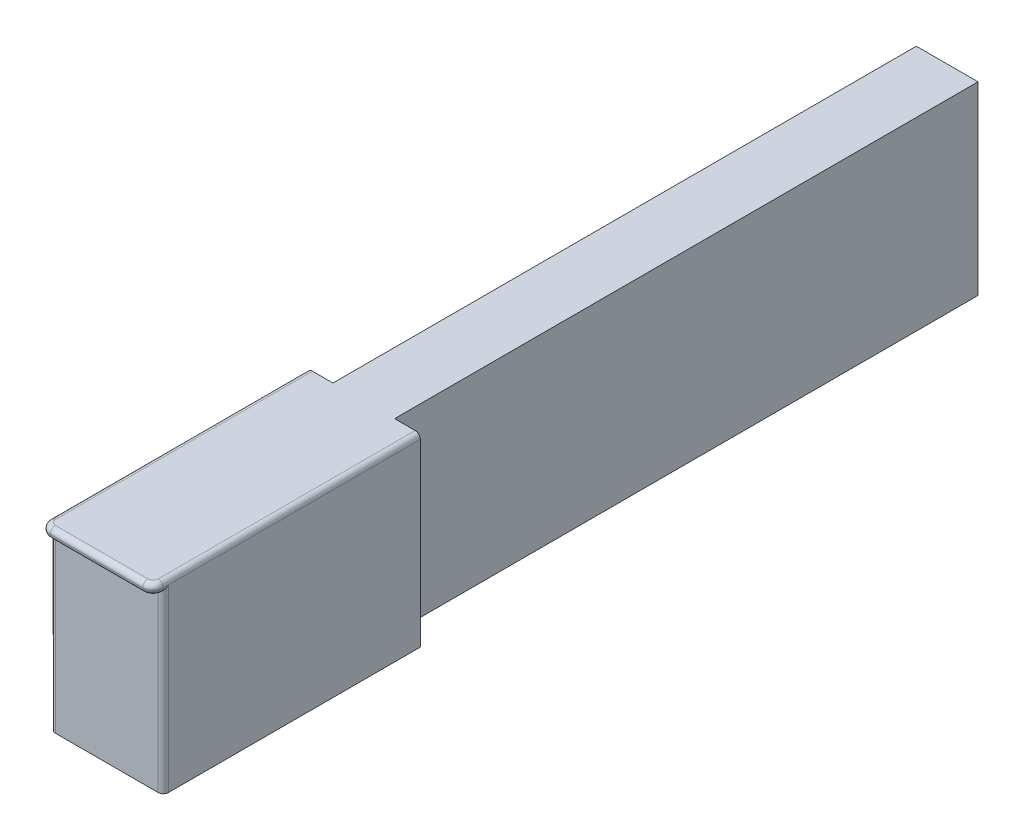
ISO-10303-21;
HEADER;
FILE_DESCRIPTION(('STEP AP214'),'2;1');
FILE_NAME('part.step','',(''),(''),'','','');
FILE_SCHEMA(('AUTOMOTIVE_DESIGN { 1 0 10303 214 1 1 1 1 }'));
ENDSEC;
DATA;
#1=APPLICATION_CONTEXT('core data for automotive mechanical design processes');
#2=APPLICATION_PROTOCOL_DEFINITION('international standard','automotive_design',2000,#1);
#3=PRODUCT_CONTEXT('',#1,'mechanical');
#4=PRODUCT('Part','Part','',(#3));
#5=PRODUCT_RELATED_PRODUCT_CATEGORY('part','',(#4));
#6=PRODUCT_DEFINITION_FORMATION('','',#4);
#7=PRODUCT_DEFINITION_CONTEXT('part definition',#1,'design');
#8=PRODUCT_DEFINITION('design','',#6,#7);
#9=PRODUCT_DEFINITION_SHAPE('','',#8);
#10=(LENGTH_UNIT() NAMED_UNIT(*) SI_UNIT(.MILLI.,.METRE.));
#11=(NAMED_UNIT(*) PLANE_ANGLE_UNIT() SI_UNIT($,.RADIAN.));
#12=(NAMED_UNIT(*) SI_UNIT($,.STERADIAN.) SOLID_ANGLE_UNIT());
#13=UNCERTAINTY_MEASURE_WITH_UNIT(LENGTH_MEASURE(1.E-05),#10,'distance_accuracy_value','');
#14=(GEOMETRIC_REPRESENTATION_CONTEXT(3) GLOBAL_UNCERTAINTY_ASSIGNED_CONTEXT((#13)) GLOBAL_UNIT_ASSIGNED_CONTEXT((#10,
#11,#12)) REPRESENTATION_CONTEXT('',''));
#15=CARTESIAN_POINT('',(0.,0.,0.));
#16=DIRECTION('',(0.,0.,1.));
#17=DIRECTION('',(1.,0.,0.));
#18=AXIS2_PLACEMENT_3D('',#15,#16,#17);
#19=CARTESIAN_POINT('',(-11.,36.,81.75));
#20=DIRECTION('',(0.,0.,-1.));
#21=DIRECTION('',(-1.,0.,0.));
#22=AXIS2_PLACEMENT_3D('',#19,#20,#21);
#23=PLANE('',#22);
#24=DIRECTION('',(1.,0.,0.));
#25=VECTOR('',#24,1.);
#26=CARTESIAN_POINT('',(-11.,34.,81.75));
#27=LINE('',#26,#25);
#28=CARTESIAN_POINT('',(-10.,34.,81.75));
#29=VERTEX_POINT('',#28);
#30=CARTESIAN_POINT('',(10.,34.,81.75));
#31=VERTEX_POINT('',#30);
#32=EDGE_CURVE('E263',#29,#31,#27,.T.);
#33=ORIENTED_EDGE('',*,*,#32,.F.);
#34=DIRECTION('',(0.,-1.,0.));
#35=VECTOR('',#34,1.);
#36=CARTESIAN_POINT('',(-10.,0.,81.75));
#37=LINE('',#36,#35);
#38=CARTESIAN_POINT('',(-10.,0.,81.75));
#39=VERTEX_POINT('',#38);
#40=EDGE_CURVE('E190',#29,#39,#37,.T.);
#41=ORIENTED_EDGE('',*,*,#40,.T.);
#42=DIRECTION('',(1.,0.,0.));
#43=VECTOR('',#42,1.);
#44=CARTESIAN_POINT('',(-11.,0.,81.75));
#45=LINE('',#44,#43);
#46=CARTESIAN_POINT('',(10.,0.,81.75));
#47=VERTEX_POINT('',#46);
#48=EDGE_CURVE('E299',#39,#47,#45,.T.);
#49=ORIENTED_EDGE('',*,*,#48,.T.);
#50=DIRECTION('',(0.,-1.,0.));
#51=VECTOR('',#50,1.);
#52=CARTESIAN_POINT('',(10.,36.,81.75));
#53=LINE('',#52,#51);
#54=EDGE_CURVE('E181',#47,#31,#53,.F.);
#55=ORIENTED_EDGE('',*,*,#54,.T.);
#56=EDGE_LOOP('',(#33,#41,#49,#55));
#57=FACE_BOUND('',#56,.T.);
#58=ADVANCED_FACE('F43',(#57),#23,.F.);
#59=CARTESIAN_POINT('',(-10.,36.,80.75));
#60=DIRECTION('',(0.,1.,0.));
#61=DIRECTION('',(0.,0.,1.));
#62=AXIS2_PLACEMENT_3D('',#59,#60,#61);
#63=CYLINDRICAL_SURFACE('',#62,1.);
#64=ORIENTED_EDGE('',*,*,#40,.F.);
#65=CARTESIAN_POINT('',(-10.,35.,80.75));
#66=DIRECTION('',(0.,-0.707106781186547,-0.707106781186547));
#67=DIRECTION('',(0.,0.707106781186547,-0.707106781186547));
#68=AXIS2_PLACEMENT_3D('',#65,#66,#67);
#69=ELLIPSE('',#68,1.41421356237309,1.);
#70=CARTESIAN_POINT('',(-11.,35.,80.75));
#71=VERTEX_POINT('',#70);
#72=EDGE_CURVE('E219',#29,#71,#69,.T.);
#73=ORIENTED_EDGE('',*,*,#72,.T.);
#74=DIRECTION('',(0.,-1.,0.));
#75=VECTOR('',#74,1.);
#76=CARTESIAN_POINT('',(-11.,36.,80.75));
#77=LINE('',#76,#75);
#78=CARTESIAN_POINT('',(-11.,0.,80.75));
#79=VERTEX_POINT('',#78);
#80=EDGE_CURVE('E195',#79,#71,#77,.F.);
#81=ORIENTED_EDGE('',*,*,#80,.F.);
#82=CARTESIAN_POINT('',(-10.,0.,80.75));
#83=DIRECTION('',(0.,1.,0.));
#84=DIRECTION('',(0.,0.,1.));
#85=AXIS2_PLACEMENT_3D('',#82,#83,#84);
#86=CIRCLE('',#85,1.);
#87=EDGE_CURVE('E176',#39,#79,#86,.F.);
#88=ORIENTED_EDGE('',*,*,#87,.F.);
#89=EDGE_LOOP('',(#64,#73,#81,#88));
#90=FACE_BOUND('',#89,.T.);
#91=ADVANCED_FACE('F369',(#90),#63,.T.);
#92=CARTESIAN_POINT('',(10.,36.,80.75));
#93=DIRECTION('',(0.,-1.,0.));
#94=DIRECTION('',(0.,0.,-1.));
#95=AXIS2_PLACEMENT_3D('',#92,#93,#94);
#96=CYLINDRICAL_SURFACE('',#95,1.);
#97=DIRECTION('',(0.,-1.,0.));
#98=VECTOR('',#97,1.);
#99=CARTESIAN_POINT('',(11.,36.,80.75));
#100=LINE('',#99,#98);
#101=CARTESIAN_POINT('',(11.,35.,80.75));
#102=VERTEX_POINT('',#101);
#103=CARTESIAN_POINT('',(11.,0.,80.75));
#104=VERTEX_POINT('',#103);
#105=EDGE_CURVE('E197',#102,#104,#100,.T.);
#106=ORIENTED_EDGE('',*,*,#105,.F.);
#107=CARTESIAN_POINT('',(10.,35.,80.75));
#108=DIRECTION('',(0.,-0.707106781186547,-0.707106781186547));
#109=DIRECTION('',(0.,0.707106781186547,-0.707106781186547));
#110=AXIS2_PLACEMENT_3D('',#107,#108,#109);
#111=ELLIPSE('',#110,1.41421356237309,1.);
#112=EDGE_CURVE('E222',#102,#31,#111,.T.);
#113=ORIENTED_EDGE('',*,*,#112,.T.);
#114=ORIENTED_EDGE('',*,*,#54,.F.);
#115=CARTESIAN_POINT('',(10.,0.,80.75));
#116=DIRECTION('',(0.,1.,0.));
#117=DIRECTION('',(0.,0.,1.));
#118=AXIS2_PLACEMENT_3D('',#115,#116,#117);
#119=CIRCLE('',#118,1.);
#120=EDGE_CURVE('E192',#104,#47,#119,.F.);
#121=ORIENTED_EDGE('',*,*,#120,.F.);
#122=EDGE_LOOP('',(#106,#113,#114,#121));
#123=FACE_BOUND('',#122,.T.);
#124=ADVANCED_FACE('F289',(#123),#96,.T.);
#125=CARTESIAN_POINT('',(11.,36.,81.75));
#126=DIRECTION('',(-1.,0.,0.));
#127=DIRECTION('',(0.,0.,1.));
#128=AXIS2_PLACEMENT_3D('',#125,#126,#127);
#129=PLANE('',#128);
#130=DIRECTION('',(0.,0.,-1.));
#131=VECTOR('',#130,1.);
#132=CARTESIAN_POINT('',(11.,0.,81.75));
#133=LINE('',#132,#131);
#134=CARTESIAN_POINT('',(11.,0.,31.75));
#135=VERTEX_POINT('',#134);
#136=EDGE_CURVE('E184',#104,#135,#133,.T.);
#137=ORIENTED_EDGE('',*,*,#136,.T.);
#138=DIRECTION('',(0.,1.,0.));
#139=VECTOR('',#138,1.);
#140=CARTESIAN_POINT('',(11.,0.,31.75));
#141=LINE('',#140,#139);
#142=CARTESIAN_POINT('',(11.,35.,31.75));
#143=VERTEX_POINT('',#142);
#144=EDGE_CURVE('E267',#135,#143,#141,.T.);
#145=ORIENTED_EDGE('',*,*,#144,.T.);
#146=DIRECTION('',(0.,0.,-1.));
#147=VECTOR('',#146,1.);
#148=CARTESIAN_POINT('',(11.,35.,81.75));
#149=LINE('',#148,#147);
#150=EDGE_CURVE('E210',#143,#102,#149,.F.);
#151=ORIENTED_EDGE('',*,*,#150,.T.);
#152=ORIENTED_EDGE('',*,*,#105,.T.);
#153=EDGE_LOOP('',(#137,#145,#151,#152));
#154=FACE_BOUND('',#153,.T.);
#155=ADVANCED_FACE('F274',(#154),#129,.F.);
#156=CARTESIAN_POINT('',(-11.,36.,-81.75));
#157=DIRECTION('',(0.,0.,-1.));
#158=DIRECTION('',(-1.,0.,0.));
#159=AXIS2_PLACEMENT_3D('',#156,#157,#158);
#160=PLANE('',#159);
#161=DIRECTION('',(0.,1.,0.));
#162=VECTOR('',#161,1.);
#163=CARTESIAN_POINT('',(-6.,0.,-81.75));
#164=LINE('',#163,#162);
#165=CARTESIAN_POINT('',(-6.,0.,-81.75));
#166=VERTEX_POINT('',#165);
#167=CARTESIAN_POINT('',(-6.,36.,-81.75));
#168=VERTEX_POINT('',#167);
#169=EDGE_CURVE('E228',#166,#168,#164,.T.);
#170=ORIENTED_EDGE('',*,*,#169,.T.);
#171=DIRECTION('',(1.,0.,0.));
#172=VECTOR('',#171,1.);
#173=CARTESIAN_POINT('',(-11.,36.,-81.75));
#174=LINE('',#173,#172);
#175=CARTESIAN_POINT('',(6.,36.,-81.75));
#176=VERTEX_POINT('',#175);
#177=EDGE_CURVE('E177',#168,#176,#174,.T.);
#178=ORIENTED_EDGE('',*,*,#177,.T.);
#179=DIRECTION('',(0.,1.,0.));
#180=VECTOR('',#179,1.);
#181=CARTESIAN_POINT('',(6.,0.,-81.75));
#182=LINE('',#181,#180);
#183=CARTESIAN_POINT('',(6.,0.,-81.75));
#184=VERTEX_POINT('',#183);
#185=EDGE_CURVE('E344',#184,#176,#182,.T.);
#186=ORIENTED_EDGE('',*,*,#185,.F.);
#187=DIRECTION('',(1.,0.,0.));
#188=VECTOR('',#187,1.);
#189=CARTESIAN_POINT('',(-11.,0.,-81.75));
#190=LINE('',#189,#188);
#191=EDGE_CURVE('E178',#166,#184,#190,.T.);
#192=ORIENTED_EDGE('',*,*,#191,.F.);
#193=EDGE_LOOP('',(#170,#178,#186,#192));
#194=FACE_BOUND('',#193,.T.);
#195=ADVANCED_FACE('F357',(#194),#160,.T.);
#196=CARTESIAN_POINT('',(-11.,36.,81.75));
#197=DIRECTION('',(-1.,0.,0.));
#198=DIRECTION('',(0.,0.,1.));
#199=AXIS2_PLACEMENT_3D('',#196,#197,#198);
#200=PLANE('',#199);
#201=DIRECTION('',(0.,1.,0.));
#202=VECTOR('',#201,1.);
#203=CARTESIAN_POINT('',(-11.,0.,31.75));
#204=LINE('',#203,#202);
#205=CARTESIAN_POINT('',(-11.,0.,31.75));
#206=VERTEX_POINT('',#205);
#207=CARTESIAN_POINT('',(-11.,35.,31.75));
#208=VERTEX_POINT('',#207);
#209=EDGE_CURVE('E57',#206,#208,#204,.T.);
#210=ORIENTED_EDGE('',*,*,#209,.F.);
#211=DIRECTION('',(0.,0.,-1.));
#212=VECTOR('',#211,1.);
#213=CARTESIAN_POINT('',(-11.,0.,81.75));
#214=LINE('',#213,#212);
#215=EDGE_CURVE('E168',#79,#206,#214,.T.);
#216=ORIENTED_EDGE('',*,*,#215,.F.);
#217=ORIENTED_EDGE('',*,*,#80,.T.);
#218=DIRECTION('',(0.,0.,-1.));
#219=VECTOR('',#218,1.);
#220=CARTESIAN_POINT('',(-11.,35.,81.75));
#221=LINE('',#220,#219);
#222=EDGE_CURVE('E171',#71,#208,#221,.T.);
#223=ORIENTED_EDGE('',*,*,#222,.T.);
#224=EDGE_LOOP('',(#210,#216,#217,#223));
#225=FACE_BOUND('',#224,.T.);
#226=ADVANCED_FACE('F167',(#225),#200,.T.);
#227=CARTESIAN_POINT('',(0.,36.,0.));
#228=DIRECTION('',(0.,1.,0.));
#229=DIRECTION('',(0.,0.,1.));
#230=AXIS2_PLACEMENT_3D('',#227,#228,#229);
#231=PLANE('',#230);
#232=DIRECTION('',(0.,0.,-1.));
#233=VECTOR('',#232,1.);
#234=CARTESIAN_POINT('',(-6.,36.,-81.75));
#235=LINE('',#234,#233);
#236=CARTESIAN_POINT('',(-5.99999999999999,36.,31.75));
#237=VERTEX_POINT('',#236);
#238=EDGE_CURVE('E162',#237,#168,#235,.T.);
#239=ORIENTED_EDGE('',*,*,#238,.F.);
#240=DIRECTION('',(1.,0.,0.));
#241=VECTOR('',#240,1.);
#242=CARTESIAN_POINT('',(-11.,36.,31.75));
#243=LINE('',#242,#241);
#244=CARTESIAN_POINT('',(-10.,36.,31.75));
#245=VERTEX_POINT('',#244);
#246=EDGE_CURVE('E277',#245,#237,#243,.T.);
#247=ORIENTED_EDGE('',*,*,#246,.F.);
#248=DIRECTION('',(0.,0.,-1.));
#249=VECTOR('',#248,1.);
#250=CARTESIAN_POINT('',(-10.,36.,0.));
#251=LINE('',#250,#249);
#252=CARTESIAN_POINT('',(-10.,36.,81.75));
#253=VERTEX_POINT('',#252);
#254=EDGE_CURVE('E199',#245,#253,#251,.F.);
#255=ORIENTED_EDGE('',*,*,#254,.T.);
#256=CARTESIAN_POINT('',(-9.,36.,81.75));
#257=DIRECTION('',(0.,1.,0.));
#258=DIRECTION('',(0.,0.,1.));
#259=AXIS2_PLACEMENT_3D('',#256,#257,#258);
#260=CIRCLE('',#259,1.);
#261=CARTESIAN_POINT('',(-9.,36.,82.75));
#262=VERTEX_POINT('',#261);
#263=EDGE_CURVE('E201',#253,#262,#260,.T.);
#264=ORIENTED_EDGE('',*,*,#263,.T.);
#265=DIRECTION('',(1.,0.,0.));
#266=VECTOR('',#265,1.);
#267=CARTESIAN_POINT('',(0.,36.,82.75));
#268=LINE('',#267,#266);
#269=CARTESIAN_POINT('',(9.,36.,82.75));
#270=VERTEX_POINT('',#269);
#271=EDGE_CURVE('E203',#262,#270,#268,.T.);
#272=ORIENTED_EDGE('',*,*,#271,.T.);
#273=CARTESIAN_POINT('',(9.,36.,81.75));
#274=DIRECTION('',(0.,1.,0.));
#275=DIRECTION('',(0.,0.,1.));
#276=AXIS2_PLACEMENT_3D('',#273,#274,#275);
#277=CIRCLE('',#276,1.);
#278=CARTESIAN_POINT('',(10.,36.,81.75));
#279=VERTEX_POINT('',#278);
#280=EDGE_CURVE('E205',#270,#279,#277,.T.);
#281=ORIENTED_EDGE('',*,*,#280,.T.);
#282=DIRECTION('',(0.,0.,-1.));
#283=VECTOR('',#282,1.);
#284=CARTESIAN_POINT('',(10.,36.,-81.75));
#285=LINE('',#284,#283);
#286=CARTESIAN_POINT('',(10.,36.,31.75));
#287=VERTEX_POINT('',#286);
#288=EDGE_CURVE('E207',#279,#287,#285,.T.);
#289=ORIENTED_EDGE('',*,*,#288,.T.);
#290=DIRECTION('',(1.,0.,0.));
#291=VECTOR('',#290,1.);
#292=CARTESIAN_POINT('',(11.,36.,31.75));
#293=LINE('',#292,#291);
#294=CARTESIAN_POINT('',(6.00000000000002,36.,31.75));
#295=VERTEX_POINT('',#294);
#296=EDGE_CURVE('E65',#295,#287,#293,.T.);
#297=ORIENTED_EDGE('',*,*,#296,.F.);
#298=DIRECTION('',(0.,0.,1.));
#299=VECTOR('',#298,1.);
#300=CARTESIAN_POINT('',(6.,36.,-81.75));
#301=LINE('',#300,#299);
#302=EDGE_CURVE('E345',#176,#295,#301,.T.);
#303=ORIENTED_EDGE('',*,*,#302,.F.);
#304=ORIENTED_EDGE('',*,*,#177,.F.);
#305=EDGE_LOOP('',(#239,#247,#255,#264,#272,#281,#289,#297,#303,#304));
#306=FACE_BOUND('',#305,.T.);
#307=ADVANCED_FACE('F330',(#306),#231,.T.);
#308=CARTESIAN_POINT('',(0.,0.,0.));
#309=DIRECTION('',(0.,1.,0.));
#310=DIRECTION('',(0.,0.,1.));
#311=AXIS2_PLACEMENT_3D('',#308,#309,#310);
#312=PLANE('',#311);
#313=DIRECTION('',(1.,0.,0.));
#314=VECTOR('',#313,1.);
#315=CARTESIAN_POINT('',(-11.,0.,31.75));
#316=LINE('',#315,#314);
#317=CARTESIAN_POINT('',(-5.99999999999999,0.,31.75));
#318=VERTEX_POINT('',#317);
#319=EDGE_CURVE('E153',#206,#318,#316,.T.);
#320=ORIENTED_EDGE('',*,*,#319,.T.);
#321=DIRECTION('',(0.,0.,-1.));
#322=VECTOR('',#321,1.);
#323=CARTESIAN_POINT('',(-6.,0.,-81.75));
#324=LINE('',#323,#322);
#325=EDGE_CURVE('E161',#318,#166,#324,.T.);
#326=ORIENTED_EDGE('',*,*,#325,.T.);
#327=ORIENTED_EDGE('',*,*,#191,.T.);
#328=DIRECTION('',(0.,0.,1.));
#329=VECTOR('',#328,1.);
#330=CARTESIAN_POINT('',(6.,0.,-81.75));
#331=LINE('',#330,#329);
#332=CARTESIAN_POINT('',(6.00000000000002,0.,31.75));
#333=VERTEX_POINT('',#332);
#334=EDGE_CURVE('E339',#184,#333,#331,.T.);
#335=ORIENTED_EDGE('',*,*,#334,.T.);
#336=DIRECTION('',(1.,0.,0.));
#337=VECTOR('',#336,1.);
#338=CARTESIAN_POINT('',(11.,0.,31.75));
#339=LINE('',#338,#337);
#340=EDGE_CURVE('E342',#333,#135,#339,.T.);
#341=ORIENTED_EDGE('',*,*,#340,.T.);
#342=ORIENTED_EDGE('',*,*,#136,.F.);
#343=ORIENTED_EDGE('',*,*,#120,.T.);
#344=ORIENTED_EDGE('',*,*,#48,.F.);
#345=ORIENTED_EDGE('',*,*,#87,.T.);
#346=ORIENTED_EDGE('',*,*,#215,.T.);
#347=EDGE_LOOP('',(#320,#326,#327,#335,#341,#342,#343,#344,#345,#346));
#348=FACE_BOUND('',#347,.T.);
#349=ADVANCED_FACE('F173',(#348),#312,.F.);
#350=CARTESIAN_POINT('',(0.,34.,0.));
#351=DIRECTION('',(0.,1.,0.));
#352=DIRECTION('',(0.,0.,1.));
#353=AXIS2_PLACEMENT_3D('',#350,#351,#352);
#354=PLANE('',#353);
#355=DIRECTION('',(1.,0.,0.));
#356=VECTOR('',#355,1.);
#357=CARTESIAN_POINT('',(-9.,34.,82.75));
#358=LINE('',#357,#356);
#359=CARTESIAN_POINT('',(9.,34.,82.75));
#360=VERTEX_POINT('',#359);
#361=CARTESIAN_POINT('',(-9.,34.,82.75));
#362=VERTEX_POINT('',#361);
#363=EDGE_CURVE('E213',#360,#362,#358,.F.);
#364=ORIENTED_EDGE('',*,*,#363,.T.);
#365=CARTESIAN_POINT('',(-9.,34.,81.75));
#366=DIRECTION('',(0.,1.,0.));
#367=DIRECTION('',(0.,0.,1.));
#368=AXIS2_PLACEMENT_3D('',#365,#366,#367);
#369=CIRCLE('',#368,1.);
#370=EDGE_CURVE('E217',#362,#29,#369,.F.);
#371=ORIENTED_EDGE('',*,*,#370,.T.);
#372=ORIENTED_EDGE('',*,*,#32,.T.);
#373=CARTESIAN_POINT('',(9.,34.,81.75));
#374=DIRECTION('',(0.,1.,0.));
#375=DIRECTION('',(0.,0.,1.));
#376=AXIS2_PLACEMENT_3D('',#373,#374,#375);
#377=CIRCLE('',#376,1.);
#378=EDGE_CURVE('E215',#31,#360,#377,.F.);
#379=ORIENTED_EDGE('',*,*,#378,.T.);
#380=EDGE_LOOP('',(#364,#371,#372,#379));
#381=FACE_BOUND('',#380,.T.);
#382=ADVANCED_FACE('F293',(#381),#354,.F.);
#383=CARTESIAN_POINT('',(-10.,35.,81.75));
#384=DIRECTION('',(0.,0.,-1.));
#385=DIRECTION('',(-1.,0.,0.));
#386=AXIS2_PLACEMENT_3D('',#383,#384,#385);
#387=CYLINDRICAL_SURFACE('',#386,1.);
#388=DIRECTION('',(0.,0.,1.));
#389=VECTOR('',#388,1.);
#390=CARTESIAN_POINT('',(-11.,35.,81.75));
#391=LINE('',#390,#389);
#392=CARTESIAN_POINT('',(-11.,35.,81.75));
#393=VERTEX_POINT('',#392);
#394=EDGE_CURVE('E258',#71,#393,#391,.T.);
#395=ORIENTED_EDGE('',*,*,#394,.F.);
#396=ORIENTED_EDGE('',*,*,#72,.F.);
#397=CARTESIAN_POINT('',(-10.,35.,81.75));
#398=DIRECTION('',(0.,0.,1.));
#399=DIRECTION('',(1.,0.,0.));
#400=AXIS2_PLACEMENT_3D('',#397,#398,#399);
#401=CIRCLE('',#400,1.);
#402=EDGE_CURVE('E261',#393,#29,#401,.T.);
#403=ORIENTED_EDGE('',*,*,#402,.F.);
#404=EDGE_LOOP('',(#395,#396,#403));
#405=FACE_BOUND('',#404,.T.);
#406=ADVANCED_FACE('F45',(#405),#387,.T.);
#407=CARTESIAN_POINT('',(-9.,35.,81.75));
#408=DIRECTION('',(0.,1.,0.));
#409=DIRECTION('',(0.,0.,1.));
#410=AXIS2_PLACEMENT_3D('',#407,#408,#409);
#411=DEGENERATE_TOROIDAL_SURFACE('',#410,1.,1.,.T.);
#412=ORIENTED_EDGE('',*,*,#402,.T.);
#413=ORIENTED_EDGE('',*,*,#370,.F.);
#414=CARTESIAN_POINT('',(-9.,35.,82.75));
#415=DIRECTION('',(1.,0.,0.));
#416=DIRECTION('',(0.,0.,-1.));
#417=AXIS2_PLACEMENT_3D('',#414,#415,#416);
#418=CIRCLE('',#417,1.);
#419=CARTESIAN_POINT('',(-9.,35.,83.75));
#420=VERTEX_POINT('',#419);
#421=EDGE_CURVE('E255',#420,#362,#418,.T.);
#422=ORIENTED_EDGE('',*,*,#421,.F.);
#423=CARTESIAN_POINT('',(-9.,35.,81.75));
#424=DIRECTION('',(0.,1.,0.));
#425=DIRECTION('',(0.,0.,1.));
#426=AXIS2_PLACEMENT_3D('',#423,#424,#425);
#427=CIRCLE('',#426,2.);
#428=EDGE_CURVE('E252',#393,#420,#427,.T.);
#429=ORIENTED_EDGE('',*,*,#428,.F.);
#430=EDGE_LOOP('',(#412,#413,#422,#429));
#431=FACE_BOUND('',#430,.T.);
#432=ADVANCED_FACE('F320',(#431),#411,.T.);
#433=CARTESIAN_POINT('',(-10.,35.,81.75));
#434=DIRECTION('',(0.,0.,-1.));
#435=DIRECTION('',(-1.,0.,0.));
#436=AXIS2_PLACEMENT_3D('',#433,#434,#435);
#437=CYLINDRICAL_SURFACE('',#436,1.);
#438=CARTESIAN_POINT('',(-10.,35.,31.75));
#439=DIRECTION('',(0.,0.,1.));
#440=DIRECTION('',(1.,0.,0.));
#441=AXIS2_PLACEMENT_3D('',#438,#439,#440);
#442=CIRCLE('',#441,1.);
#443=EDGE_CURVE('E11',#208,#245,#442,.F.);
#444=ORIENTED_EDGE('',*,*,#443,.F.);
#445=ORIENTED_EDGE('',*,*,#222,.F.);
#446=ORIENTED_EDGE('',*,*,#394,.T.);
#447=CARTESIAN_POINT('',(-10.,35.,81.75));
#448=DIRECTION('',(0.,0.,1.));
#449=DIRECTION('',(1.,0.,0.));
#450=AXIS2_PLACEMENT_3D('',#447,#448,#449);
#451=CIRCLE('',#450,1.);
#452=EDGE_CURVE('E249',#253,#393,#451,.T.);
#453=ORIENTED_EDGE('',*,*,#452,.F.);
#454=ORIENTED_EDGE('',*,*,#254,.F.);
#455=EDGE_LOOP('',(#444,#445,#446,#453,#454));
#456=FACE_BOUND('',#455,.T.);
#457=ADVANCED_FACE('F325',(#456),#437,.T.);
#458=CARTESIAN_POINT('',(-11.,35.,82.75));
#459=DIRECTION('',(-1.,0.,0.));
#460=DIRECTION('',(0.,0.,1.));
#461=AXIS2_PLACEMENT_3D('',#458,#459,#460);
#462=CYLINDRICAL_SURFACE('',#461,1.);
#463=ORIENTED_EDGE('',*,*,#421,.T.);
#464=ORIENTED_EDGE('',*,*,#363,.F.);
#465=CARTESIAN_POINT('',(9.,35.,82.75));
#466=DIRECTION('',(1.,0.,0.));
#467=DIRECTION('',(0.,0.,-1.));
#468=AXIS2_PLACEMENT_3D('',#465,#466,#467);
#469=CIRCLE('',#468,1.);
#470=CARTESIAN_POINT('',(9.,35.,83.75));
#471=VERTEX_POINT('',#470);
#472=EDGE_CURVE('E246',#471,#360,#469,.T.);
#473=ORIENTED_EDGE('',*,*,#472,.F.);
#474=DIRECTION('',(1.,0.,0.));
#475=VECTOR('',#474,1.);
#476=CARTESIAN_POINT('',(9.,35.,83.75));
#477=LINE('',#476,#475);
#478=EDGE_CURVE('E243',#420,#471,#477,.T.);
#479=ORIENTED_EDGE('',*,*,#478,.F.);
#480=EDGE_LOOP('',(#463,#464,#473,#479));
#481=FACE_BOUND('',#480,.T.);
#482=ADVANCED_FACE('F307',(#481),#462,.T.);
#483=CARTESIAN_POINT('',(-9.,35.,81.75));
#484=DIRECTION('',(0.,1.,0.));
#485=DIRECTION('',(0.,0.,1.));
#486=AXIS2_PLACEMENT_3D('',#483,#484,#485);
#487=DEGENERATE_TOROIDAL_SURFACE('',#486,1.,1.,.T.);
#488=ORIENTED_EDGE('',*,*,#452,.T.);
#489=ORIENTED_EDGE('',*,*,#428,.T.);
#490=CARTESIAN_POINT('',(-9.,35.,82.75));
#491=DIRECTION('',(1.,0.,0.));
#492=DIRECTION('',(0.,0.,-1.));
#493=AXIS2_PLACEMENT_3D('',#490,#491,#492);
#494=CIRCLE('',#493,1.);
#495=EDGE_CURVE('E240',#262,#420,#494,.T.);
#496=ORIENTED_EDGE('',*,*,#495,.F.);
#497=ORIENTED_EDGE('',*,*,#263,.F.);
#498=EDGE_LOOP('',(#488,#489,#496,#497));
#499=FACE_BOUND('',#498,.T.);
#500=ADVANCED_FACE('F316',(#499),#487,.T.);
#501=CARTESIAN_POINT('',(9.,35.,81.75));
#502=DIRECTION('',(0.,1.,0.));
#503=DIRECTION('',(0.,0.,1.));
#504=AXIS2_PLACEMENT_3D('',#501,#502,#503);
#505=DEGENERATE_TOROIDAL_SURFACE('',#504,1.,1.,.T.);
#506=ORIENTED_EDGE('',*,*,#472,.T.);
#507=ORIENTED_EDGE('',*,*,#378,.F.);
#508=CARTESIAN_POINT('',(10.,35.,81.75));
#509=DIRECTION('',(0.,0.,-1.));
#510=DIRECTION('',(-1.,0.,0.));
#511=AXIS2_PLACEMENT_3D('',#508,#509,#510);
#512=CIRCLE('',#511,1.);
#513=CARTESIAN_POINT('',(11.,35.,81.75));
#514=VERTEX_POINT('',#513);
#515=EDGE_CURVE('E237',#514,#31,#512,.T.);
#516=ORIENTED_EDGE('',*,*,#515,.F.);
#517=CARTESIAN_POINT('',(9.,35.,81.75));
#518=DIRECTION('',(0.,1.,0.));
#519=DIRECTION('',(0.,0.,1.));
#520=AXIS2_PLACEMENT_3D('',#517,#518,#519);
#521=CIRCLE('',#520,2.);
#522=EDGE_CURVE('E234',#471,#514,#521,.T.);
#523=ORIENTED_EDGE('',*,*,#522,.F.);
#524=EDGE_LOOP('',(#506,#507,#516,#523));
#525=FACE_BOUND('',#524,.T.);
#526=ADVANCED_FACE('F303',(#525),#505,.T.);
#527=CARTESIAN_POINT('',(0.,35.,82.75));
#528=DIRECTION('',(1.,0.,0.));
#529=DIRECTION('',(0.,0.,-1.));
#530=AXIS2_PLACEMENT_3D('',#527,#528,#529);
#531=CYLINDRICAL_SURFACE('',#530,1.);
#532=ORIENTED_EDGE('',*,*,#495,.T.);
#533=ORIENTED_EDGE('',*,*,#478,.T.);
#534=CARTESIAN_POINT('',(9.,35.,82.75));
#535=DIRECTION('',(1.,0.,0.));
#536=DIRECTION('',(0.,0.,-1.));
#537=AXIS2_PLACEMENT_3D('',#534,#535,#536);
#538=CIRCLE('',#537,1.);
#539=EDGE_CURVE('E231',#270,#471,#538,.T.);
#540=ORIENTED_EDGE('',*,*,#539,.F.);
#541=ORIENTED_EDGE('',*,*,#271,.F.);
#542=EDGE_LOOP('',(#532,#533,#540,#541));
#543=FACE_BOUND('',#542,.T.);
#544=ADVANCED_FACE('F310',(#543),#531,.T.);
#545=CARTESIAN_POINT('',(10.,35.,81.75));
#546=DIRECTION('',(0.,0.,-1.));
#547=DIRECTION('',(-1.,0.,0.));
#548=AXIS2_PLACEMENT_3D('',#545,#546,#547);
#549=CYLINDRICAL_SURFACE('',#548,1.);
#550=ORIENTED_EDGE('',*,*,#515,.T.);
#551=ORIENTED_EDGE('',*,*,#112,.F.);
#552=DIRECTION('',(0.,0.,-1.));
#553=VECTOR('',#552,1.);
#554=CARTESIAN_POINT('',(11.,35.,81.75));
#555=LINE('',#554,#553);
#556=EDGE_CURVE('E227',#514,#102,#555,.T.);
#557=ORIENTED_EDGE('',*,*,#556,.F.);
#558=EDGE_LOOP('',(#550,#551,#557));
#559=FACE_BOUND('',#558,.T.);
#560=ADVANCED_FACE('F285',(#559),#549,.T.);
#561=CARTESIAN_POINT('',(9.,35.,81.75));
#562=DIRECTION('',(0.,1.,0.));
#563=DIRECTION('',(0.,0.,1.));
#564=AXIS2_PLACEMENT_3D('',#561,#562,#563);
#565=DEGENERATE_TOROIDAL_SURFACE('',#564,1.,1.,.T.);
#566=ORIENTED_EDGE('',*,*,#539,.T.);
#567=ORIENTED_EDGE('',*,*,#522,.T.);
#568=CARTESIAN_POINT('',(10.,35.,81.75));
#569=DIRECTION('',(0.,0.,-1.));
#570=DIRECTION('',(-1.,0.,0.));
#571=AXIS2_PLACEMENT_3D('',#568,#569,#570);
#572=CIRCLE('',#571,1.);
#573=EDGE_CURVE('E224',#279,#514,#572,.T.);
#574=ORIENTED_EDGE('',*,*,#573,.F.);
#575=ORIENTED_EDGE('',*,*,#280,.F.);
#576=EDGE_LOOP('',(#566,#567,#574,#575));
#577=FACE_BOUND('',#576,.T.);
#578=ADVANCED_FACE('F383',(#577),#565,.T.);
#579=CARTESIAN_POINT('',(10.,35.,0.));
#580=DIRECTION('',(0.,0.,1.));
#581=DIRECTION('',(1.,0.,0.));
#582=AXIS2_PLACEMENT_3D('',#579,#580,#581);
#583=CYLINDRICAL_SURFACE('',#582,1.);
#584=CARTESIAN_POINT('',(10.,35.,31.75));
#585=DIRECTION('',(0.,0.,1.));
#586=DIRECTION('',(1.,0.,0.));
#587=AXIS2_PLACEMENT_3D('',#584,#585,#586);
#588=CIRCLE('',#587,1.);
#589=EDGE_CURVE('E51',#287,#143,#588,.F.);
#590=ORIENTED_EDGE('',*,*,#589,.F.);
#591=ORIENTED_EDGE('',*,*,#288,.F.);
#592=ORIENTED_EDGE('',*,*,#573,.T.);
#593=ORIENTED_EDGE('',*,*,#556,.T.);
#594=ORIENTED_EDGE('',*,*,#150,.F.);
#595=EDGE_LOOP('',(#590,#591,#592,#593,#594));
#596=FACE_BOUND('',#595,.T.);
#597=ADVANCED_FACE('F280',(#596),#583,.T.);
#598=CARTESIAN_POINT('',(11.,0.,31.75));
#599=DIRECTION('',(0.,0.,1.));
#600=DIRECTION('',(1.,0.,0.));
#601=AXIS2_PLACEMENT_3D('',#598,#599,#600);
#602=PLANE('',#601);
#603=ORIENTED_EDGE('',*,*,#589,.T.);
#604=ORIENTED_EDGE('',*,*,#144,.F.);
#605=ORIENTED_EDGE('',*,*,#340,.F.);
#606=DIRECTION('',(0.,1.,0.));
#607=VECTOR('',#606,1.);
#608=CARTESIAN_POINT('',(6.00000000000002,0.,31.75));
#609=LINE('',#608,#607);
#610=EDGE_CURVE('E278',#333,#295,#609,.T.);
#611=ORIENTED_EDGE('',*,*,#610,.T.);
#612=ORIENTED_EDGE('',*,*,#296,.T.);
#613=EDGE_LOOP('',(#603,#604,#605,#611,#612));
#614=FACE_BOUND('',#613,.T.);
#615=ADVANCED_FACE('F265',(#614),#602,.F.);
#616=CARTESIAN_POINT('',(6.,0.,-81.75));
#617=DIRECTION('',(-1.,0.,0.));
#618=DIRECTION('',(0.,0.,1.));
#619=AXIS2_PLACEMENT_3D('',#616,#617,#618);
#620=PLANE('',#619);
#621=ORIENTED_EDGE('',*,*,#302,.T.);
#622=ORIENTED_EDGE('',*,*,#610,.F.);
#623=ORIENTED_EDGE('',*,*,#334,.F.);
#624=ORIENTED_EDGE('',*,*,#185,.T.);
#625=EDGE_LOOP('',(#621,#622,#623,#624));
#626=FACE_BOUND('',#625,.T.);
#627=ADVANCED_FACE('F354',(#626),#620,.F.);
#628=CARTESIAN_POINT('',(-6.,0.,-81.75));
#629=DIRECTION('',(1.,0.,0.));
#630=DIRECTION('',(0.,0.,-1.));
#631=AXIS2_PLACEMENT_3D('',#628,#629,#630);
#632=PLANE('',#631);
#633=ORIENTED_EDGE('',*,*,#238,.T.);
#634=ORIENTED_EDGE('',*,*,#169,.F.);
#635=ORIENTED_EDGE('',*,*,#325,.F.);
#636=DIRECTION('',(0.,1.,0.));
#637=VECTOR('',#636,1.);
#638=CARTESIAN_POINT('',(-5.99999999999999,0.,31.75));
#639=LINE('',#638,#637);
#640=EDGE_CURVE('E156',#318,#237,#639,.T.);
#641=ORIENTED_EDGE('',*,*,#640,.T.);
#642=EDGE_LOOP('',(#633,#634,#635,#641));
#643=FACE_BOUND('',#642,.T.);
#644=ADVANCED_FACE('F359',(#643),#632,.F.);
#645=CARTESIAN_POINT('',(-11.,0.,31.75));
#646=DIRECTION('',(0.,0.,1.));
#647=DIRECTION('',(1.,0.,0.));
#648=AXIS2_PLACEMENT_3D('',#645,#646,#647);
#649=PLANE('',#648);
#650=ORIENTED_EDGE('',*,*,#443,.T.);
#651=ORIENTED_EDGE('',*,*,#246,.T.);
#652=ORIENTED_EDGE('',*,*,#640,.F.);
#653=ORIENTED_EDGE('',*,*,#319,.F.);
#654=ORIENTED_EDGE('',*,*,#209,.T.);
#655=EDGE_LOOP('',(#650,#651,#652,#653,#654));
#656=FACE_BOUND('',#655,.T.);
#657=ADVANCED_FACE('F154',(#656),#649,.F.);
#658=CLOSED_SHELL('',(#58,#91,#124,#155,#195,#226,#307,#349,#382,#406,#432,#457,#482,#500,#526,
#544,#560,#578,#597,#615,#627,#644,#657));
#659=MANIFOLD_SOLID_BREP('B2',#658);
#660=ADVANCED_BREP_SHAPE_REPRESENTATION('',(#18,#659),#14);
#661=SHAPE_DEFINITION_REPRESENTATION(#9,#660);
ENDSEC;
END-ISO-10303-21;
